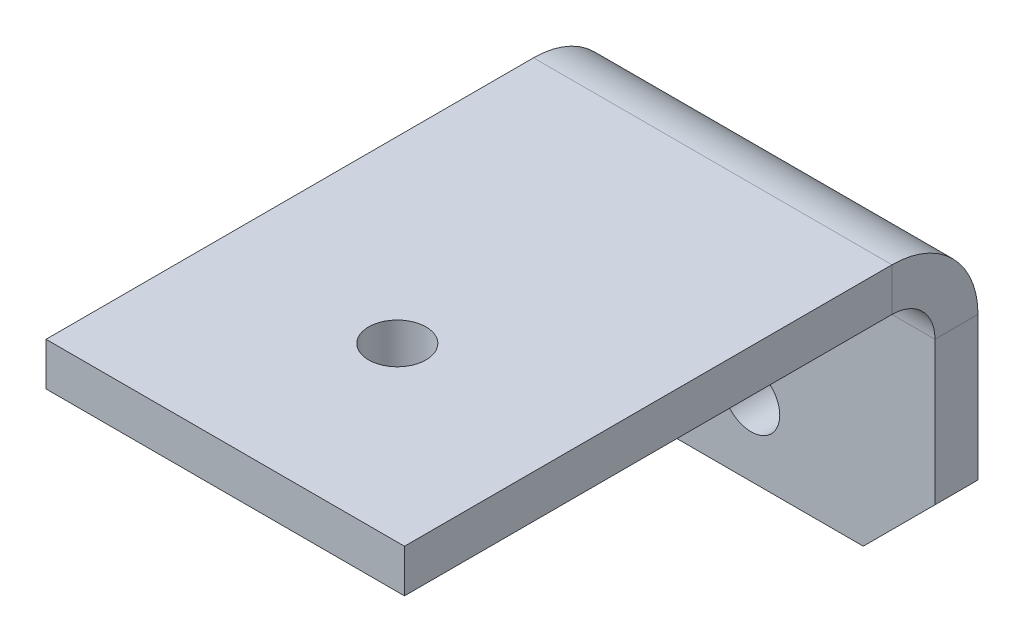
ISO-10303-21;
HEADER;
FILE_DESCRIPTION(('STEP AP214'),'2;1');
FILE_NAME('part.step','',(''),(''),'','','');
FILE_SCHEMA(('AUTOMOTIVE_DESIGN { 1 0 10303 214 1 1 1 1 }'));
ENDSEC;
DATA;
#1=APPLICATION_CONTEXT('core data for automotive mechanical design processes');
#2=APPLICATION_PROTOCOL_DEFINITION('international standard','automotive_design',2000,#1);
#3=PRODUCT_CONTEXT('',#1,'mechanical');
#4=PRODUCT('Part','Part','',(#3));
#5=PRODUCT_RELATED_PRODUCT_CATEGORY('part','',(#4));
#6=PRODUCT_DEFINITION_FORMATION('','',#4);
#7=PRODUCT_DEFINITION_CONTEXT('part definition',#1,'design');
#8=PRODUCT_DEFINITION('design','',#6,#7);
#9=PRODUCT_DEFINITION_SHAPE('','',#8);
#10=(LENGTH_UNIT() NAMED_UNIT(*) SI_UNIT(.MILLI.,.METRE.));
#11=(NAMED_UNIT(*) PLANE_ANGLE_UNIT() SI_UNIT($,.RADIAN.));
#12=(NAMED_UNIT(*) SI_UNIT($,.STERADIAN.) SOLID_ANGLE_UNIT());
#13=UNCERTAINTY_MEASURE_WITH_UNIT(LENGTH_MEASURE(1.E-05),#10,'distance_accuracy_value','');
#14=(GEOMETRIC_REPRESENTATION_CONTEXT(3) GLOBAL_UNCERTAINTY_ASSIGNED_CONTEXT((#13)) GLOBAL_UNIT_ASSIGNED_CONTEXT((#10,
#11,#12)) REPRESENTATION_CONTEXT('',''));
#15=CARTESIAN_POINT('',(0.,0.,0.));
#16=DIRECTION('',(0.,0.,1.));
#17=DIRECTION('',(1.,0.,0.));
#18=AXIS2_PLACEMENT_3D('',#15,#16,#17);
#19=CARTESIAN_POINT('',(-12.1740943166717,9.19624747560956,-3.));
#20=DIRECTION('',(-1.,0.,0.));
#21=DIRECTION('',(0.,-1.,0.));
#22=AXIS2_PLACEMENT_3D('',#19,#20,#21);
#23=PLANE('',#22);
#24=DIRECTION('',(0.,-1.,0.));
#25=VECTOR('',#24,1.);
#26=CARTESIAN_POINT('',(-12.1740943166717,9.19624747560956,-3.));
#27=LINE('',#26,#25);
#28=CARTESIAN_POINT('',(-12.1740943166717,9.19624747560956,-3.));
#29=VERTEX_POINT('',#28);
#30=CARTESIAN_POINT('',(-12.1740943166717,-0.803752524390404,-3.));
#31=VERTEX_POINT('',#30);
#32=EDGE_CURVE('E200',#29,#31,#27,.T.);
#33=ORIENTED_EDGE('',*,*,#32,.T.);
#34=DIRECTION('',(0.,0.,1.));
#35=VECTOR('',#34,1.);
#36=CARTESIAN_POINT('',(-12.1740943166717,-0.803752524390404,-3.));
#37=LINE('',#36,#35);
#38=CARTESIAN_POINT('',(-12.1740943166717,-0.803752524390404,0.));
#39=VERTEX_POINT('',#38);
#40=EDGE_CURVE('E224',#31,#39,#37,.T.);
#41=ORIENTED_EDGE('',*,*,#40,.T.);
#42=DIRECTION('',(0.,-1.,0.));
#43=VECTOR('',#42,1.);
#44=CARTESIAN_POINT('',(-12.1740943166717,9.19624747560956,0.));
#45=LINE('',#44,#43);
#46=CARTESIAN_POINT('',(-12.1740943166717,9.19624747560956,0.));
#47=VERTEX_POINT('',#46);
#48=EDGE_CURVE('E197',#47,#39,#45,.T.);
#49=ORIENTED_EDGE('',*,*,#48,.F.);
#50=DIRECTION('',(0.,0.,1.));
#51=VECTOR('',#50,1.);
#52=CARTESIAN_POINT('',(-12.1740943166717,9.19624747560956,-3.));
#53=LINE('',#52,#51);
#54=EDGE_CURVE('E221',#29,#47,#53,.T.);
#55=ORIENTED_EDGE('',*,*,#54,.F.);
#56=EDGE_LOOP('',(#33,#41,#49,#55));
#57=FACE_BOUND('',#56,.T.);
#58=ADVANCED_FACE('F58',(#57),#23,.T.);
#59=CARTESIAN_POINT('',(12.8259056833283,9.19624747560956,-3.));
#60=DIRECTION('',(1.,0.,0.));
#61=DIRECTION('',(0.,1.,0.));
#62=AXIS2_PLACEMENT_3D('',#59,#60,#61);
#63=PLANE('',#62);
#64=DIRECTION('',(0.,1.,0.));
#65=VECTOR('',#64,1.);
#66=CARTESIAN_POINT('',(12.8259056833283,9.19624747560956,0.));
#67=LINE('',#66,#65);
#68=CARTESIAN_POINT('',(12.8259056833283,-0.803752524390404,0.));
#69=VERTEX_POINT('',#68);
#70=CARTESIAN_POINT('',(12.8259056833283,9.19624747560956,0.));
#71=VERTEX_POINT('',#70);
#72=EDGE_CURVE('E217',#69,#71,#67,.T.);
#73=ORIENTED_EDGE('',*,*,#72,.F.);
#74=DIRECTION('',(0.,0.,-1.));
#75=VECTOR('',#74,1.);
#76=CARTESIAN_POINT('',(12.8259056833283,-0.803752524390404,-3.));
#77=LINE('',#76,#75);
#78=CARTESIAN_POINT('',(12.8259056833283,-0.803752524390404,-3.));
#79=VERTEX_POINT('',#78);
#80=EDGE_CURVE('E67',#69,#79,#77,.T.);
#81=ORIENTED_EDGE('',*,*,#80,.T.);
#82=DIRECTION('',(0.,1.,0.));
#83=VECTOR('',#82,1.);
#84=CARTESIAN_POINT('',(12.8259056833283,9.19624747560956,-3.));
#85=LINE('',#84,#83);
#86=CARTESIAN_POINT('',(12.8259056833283,9.19624747560956,-3.));
#87=VERTEX_POINT('',#86);
#88=EDGE_CURVE('E207',#79,#87,#85,.T.);
#89=ORIENTED_EDGE('',*,*,#88,.T.);
#90=DIRECTION('',(0.,0.,1.));
#91=VECTOR('',#90,1.);
#92=CARTESIAN_POINT('',(12.8259056833283,9.19624747560956,-3.));
#93=LINE('',#92,#91);
#94=EDGE_CURVE('E212',#87,#71,#93,.T.);
#95=ORIENTED_EDGE('',*,*,#94,.T.);
#96=EDGE_LOOP('',(#73,#81,#89,#95));
#97=FACE_BOUND('',#96,.T.);
#98=ADVANCED_FACE('F263',(#97),#63,.T.);
#99=CARTESIAN_POINT('',(-12.1740943166717,-5.80375252439044,-3.));
#100=DIRECTION('',(0.,-1.,0.));
#101=DIRECTION('',(0.,0.,-1.));
#102=AXIS2_PLACEMENT_3D('',#99,#100,#101);
#103=PLANE('',#102);
#104=DIRECTION('',(1.,0.,0.));
#105=VECTOR('',#104,1.);
#106=CARTESIAN_POINT('',(-12.1740943166717,-5.80375252439044,-3.));
#107=LINE('',#106,#105);
#108=CARTESIAN_POINT('',(-7.17409431667171,-5.80375252439044,-3.));
#109=VERTEX_POINT('',#108);
#110=CARTESIAN_POINT('',(7.82590568332822,-5.80375252439044,-3.));
#111=VERTEX_POINT('',#110);
#112=EDGE_CURVE('E203',#109,#111,#107,.T.);
#113=ORIENTED_EDGE('',*,*,#112,.T.);
#114=DIRECTION('',(0.,0.,1.));
#115=VECTOR('',#114,1.);
#116=CARTESIAN_POINT('',(7.82590568332822,-5.80375252439044,-3.));
#117=LINE('',#116,#115);
#118=CARTESIAN_POINT('',(7.82590568332822,-5.80375252439044,0.));
#119=VERTEX_POINT('',#118);
#120=EDGE_CURVE('E235',#111,#119,#117,.T.);
#121=ORIENTED_EDGE('',*,*,#120,.T.);
#122=DIRECTION('',(1.,0.,0.));
#123=VECTOR('',#122,1.);
#124=CARTESIAN_POINT('',(-12.1740943166717,-5.80375252439044,0.));
#125=LINE('',#124,#123);
#126=CARTESIAN_POINT('',(-7.17409431667171,-5.80375252439044,0.));
#127=VERTEX_POINT('',#126);
#128=EDGE_CURVE('E215',#127,#119,#125,.T.);
#129=ORIENTED_EDGE('',*,*,#128,.F.);
#130=DIRECTION('',(0.,0.,-1.));
#131=VECTOR('',#130,1.);
#132=CARTESIAN_POINT('',(-7.17409431667171,-5.80375252439044,-3.));
#133=LINE('',#132,#131);
#134=EDGE_CURVE('E231',#127,#109,#133,.T.);
#135=ORIENTED_EDGE('',*,*,#134,.T.);
#136=EDGE_LOOP('',(#113,#121,#129,#135));
#137=FACE_BOUND('',#136,.T.);
#138=ADVANCED_FACE('F241',(#137),#103,.T.);
#139=CARTESIAN_POINT('',(0.,0.,-3.));
#140=DIRECTION('',(0.,0.,1.));
#141=DIRECTION('',(1.,0.,0.));
#142=AXIS2_PLACEMENT_3D('',#139,#140,#141);
#143=PLANE('',#142);
#144=CARTESIAN_POINT('',(0.,-0.80375252439044,-3.));
#145=DIRECTION('',(0.,0.,1.));
#146=DIRECTION('',(1.,0.,0.));
#147=AXIS2_PLACEMENT_3D('',#144,#145,#146);
#148=CIRCLE('',#147,2.);
#149=CARTESIAN_POINT('',(2.,-0.80375252439044,-3.));
#150=VERTEX_POINT('',#149);
#151=EDGE_CURVE('E194',#150,#150,#148,.T.);
#152=ORIENTED_EDGE('',*,*,#151,.T.);
#153=EDGE_LOOP('',(#152));
#154=FACE_BOUND('',#153,.T.);
#155=ORIENTED_EDGE('',*,*,#88,.F.);
#156=DIRECTION('',(0.707106781186547,0.707106781186548,0.));
#157=VECTOR('',#156,1.);
#158=CARTESIAN_POINT('',(7.82590568332822,-5.80375252439044,-3.));
#159=LINE('',#158,#157);
#160=EDGE_CURVE('E13',#79,#111,#159,.F.);
#161=ORIENTED_EDGE('',*,*,#160,.T.);
#162=ORIENTED_EDGE('',*,*,#112,.F.);
#163=DIRECTION('',(0.707106781186548,-0.707106781186547,0.));
#164=VECTOR('',#163,1.);
#165=CARTESIAN_POINT('',(-12.1740943166717,-0.803752524390404,-3.));
#166=LINE('',#165,#164);
#167=EDGE_CURVE('E233',#109,#31,#166,.F.);
#168=ORIENTED_EDGE('',*,*,#167,.T.);
#169=ORIENTED_EDGE('',*,*,#32,.F.);
#170=DIRECTION('',(-1.,0.,0.));
#171=VECTOR('',#170,1.);
#172=CARTESIAN_POINT('',(-12.1740943166717,9.19624747560956,-3.));
#173=LINE('',#172,#171);
#174=EDGE_CURVE('E209',#87,#29,#173,.T.);
#175=ORIENTED_EDGE('',*,*,#174,.F.);
#176=EDGE_LOOP('',(#155,#161,#162,#168,#169,#175));
#177=FACE_BOUND('',#176,.T.);
#178=ADVANCED_FACE('F255',(#154,#177),#143,.F.);
#179=CARTESIAN_POINT('',(0.,0.,0.));
#180=DIRECTION('',(0.,0.,1.));
#181=DIRECTION('',(1.,0.,0.));
#182=AXIS2_PLACEMENT_3D('',#179,#180,#181);
#183=PLANE('',#182);
#184=CARTESIAN_POINT('',(0.,-0.80375252439044,0.));
#185=DIRECTION('',(0.,0.,1.));
#186=DIRECTION('',(1.,0.,0.));
#187=AXIS2_PLACEMENT_3D('',#184,#185,#186);
#188=CIRCLE('',#187,2.);
#189=CARTESIAN_POINT('',(2.,-0.80375252439044,0.));
#190=VERTEX_POINT('',#189);
#191=EDGE_CURVE('E184',#190,#190,#188,.T.);
#192=ORIENTED_EDGE('',*,*,#191,.F.);
#193=EDGE_LOOP('',(#192));
#194=FACE_BOUND('',#193,.T.);
#195=ORIENTED_EDGE('',*,*,#128,.T.);
#196=DIRECTION('',(-0.707106781186547,-0.707106781186548,0.));
#197=VECTOR('',#196,1.);
#198=CARTESIAN_POINT('',(6.81482910385933,-6.81482910385933,0.));
#199=LINE('',#198,#197);
#200=EDGE_CURVE('E81',#119,#69,#199,.F.);
#201=ORIENTED_EDGE('',*,*,#200,.T.);
#202=ORIENTED_EDGE('',*,*,#72,.T.);
#203=DIRECTION('',(-1.,0.,0.));
#204=VECTOR('',#203,1.);
#205=CARTESIAN_POINT('',(-12.1740943166717,9.19624747560956,0.));
#206=LINE('',#205,#204);
#207=EDGE_CURVE('E204',#71,#47,#206,.T.);
#208=ORIENTED_EDGE('',*,*,#207,.T.);
#209=ORIENTED_EDGE('',*,*,#48,.T.);
#210=DIRECTION('',(-0.707106781186548,0.707106781186547,0.));
#211=VECTOR('',#210,1.);
#212=CARTESIAN_POINT('',(-6.48892342053107,-6.48892342053108,0.));
#213=LINE('',#212,#211);
#214=EDGE_CURVE('E229',#39,#127,#213,.F.);
#215=ORIENTED_EDGE('',*,*,#214,.T.);
#216=EDGE_LOOP('',(#195,#201,#202,#208,#209,#215));
#217=FACE_BOUND('',#216,.T.);
#218=ADVANCED_FACE('F246',(#194,#217),#183,.T.);
#219=CARTESIAN_POINT('',(0.,-0.80375252439044,-3.));
#220=DIRECTION('',(0.,0.,1.));
#221=DIRECTION('',(1.,0.,0.));
#222=AXIS2_PLACEMENT_3D('',#219,#220,#221);
#223=CYLINDRICAL_SURFACE('',#222,2.);
#224=ORIENTED_EDGE('',*,*,#151,.F.);
#225=EDGE_LOOP('',(#224));
#226=FACE_BOUND('',#225,.T.);
#227=ORIENTED_EDGE('',*,*,#191,.T.);
#228=EDGE_LOOP('',(#227));
#229=FACE_BOUND('',#228,.T.);
#230=ADVANCED_FACE('F279',(#226,#229),#223,.F.);
#231=CARTESIAN_POINT('',(12.8259056833283,9.19624747560956,3.));
#232=DIRECTION('',(1.,0.,0.));
#233=DIRECTION('',(0.,0.,-1.));
#234=AXIS2_PLACEMENT_3D('',#231,#232,#233);
#235=PLANE('',#234);
#236=DIRECTION('',(0.,-1.,0.));
#237=VECTOR('',#236,1.);
#238=CARTESIAN_POINT('',(12.8259056833283,15.1962474756096,2.99999999999998));
#239=LINE('',#238,#237);
#240=CARTESIAN_POINT('',(12.8259056833283,12.1962474756096,2.99999999999999));
#241=VERTEX_POINT('',#240);
#242=CARTESIAN_POINT('',(12.8259056833283,15.1962474756096,2.99999999999998));
#243=VERTEX_POINT('',#242);
#244=EDGE_CURVE('E158',#241,#243,#239,.F.);
#245=ORIENTED_EDGE('',*,*,#244,.F.);
#246=CARTESIAN_POINT('',(12.8259056833283,9.19624747560956,3.));
#247=DIRECTION('',(-1.,0.,0.));
#248=DIRECTION('',(0.,0.,1.));
#249=AXIS2_PLACEMENT_3D('',#246,#247,#248);
#250=CIRCLE('',#249,3.);
#251=EDGE_CURVE('E188',#71,#241,#250,.F.);
#252=ORIENTED_EDGE('',*,*,#251,.F.);
#253=ORIENTED_EDGE('',*,*,#94,.F.);
#254=CARTESIAN_POINT('',(12.8259056833283,9.19624747560956,3.));
#255=DIRECTION('',(-1.,0.,0.));
#256=DIRECTION('',(0.,0.,1.));
#257=AXIS2_PLACEMENT_3D('',#254,#255,#256);
#258=CIRCLE('',#257,6.);
#259=EDGE_CURVE('E181',#87,#243,#258,.F.);
#260=ORIENTED_EDGE('',*,*,#259,.T.);
#261=EDGE_LOOP('',(#245,#252,#253,#260));
#262=FACE_BOUND('',#261,.T.);
#263=ADVANCED_FACE('F286',(#262),#235,.T.);
#264=CARTESIAN_POINT('',(-12.1740943166717,9.19624747560956,3.));
#265=DIRECTION('',(1.,0.,0.));
#266=DIRECTION('',(0.,0.,-1.));
#267=AXIS2_PLACEMENT_3D('',#264,#265,#266);
#268=PLANE('',#267);
#269=CARTESIAN_POINT('',(-12.1740943166717,9.19624747560956,3.));
#270=DIRECTION('',(-1.,0.,0.));
#271=DIRECTION('',(0.,0.,1.));
#272=AXIS2_PLACEMENT_3D('',#269,#270,#271);
#273=CIRCLE('',#272,3.);
#274=CARTESIAN_POINT('',(-12.1740943166717,12.1962474756096,2.99999999999999));
#275=VERTEX_POINT('',#274);
#276=EDGE_CURVE('E191',#275,#47,#273,.T.);
#277=ORIENTED_EDGE('',*,*,#276,.F.);
#278=DIRECTION('',(0.,-1.,0.));
#279=VECTOR('',#278,1.);
#280=CARTESIAN_POINT('',(-12.1740943166718,12.1962474756096,2.99999999999999));
#281=LINE('',#280,#279);
#282=CARTESIAN_POINT('',(-12.1740943166717,15.1962474756096,2.99999999999998));
#283=VERTEX_POINT('',#282);
#284=EDGE_CURVE('E175',#275,#283,#281,.F.);
#285=ORIENTED_EDGE('',*,*,#284,.T.);
#286=CARTESIAN_POINT('',(-12.1740943166717,9.19624747560956,3.));
#287=DIRECTION('',(-1.,0.,0.));
#288=DIRECTION('',(0.,0.,1.));
#289=AXIS2_PLACEMENT_3D('',#286,#287,#288);
#290=CIRCLE('',#289,6.);
#291=EDGE_CURVE('E185',#283,#29,#290,.T.);
#292=ORIENTED_EDGE('',*,*,#291,.T.);
#293=ORIENTED_EDGE('',*,*,#54,.T.);
#294=EDGE_LOOP('',(#277,#285,#292,#293));
#295=FACE_BOUND('',#294,.T.);
#296=ADVANCED_FACE('F288',(#295),#268,.F.);
#297=CARTESIAN_POINT('',(-12.1740943166718,9.19624747560956,3.));
#298=DIRECTION('',(-1.,0.,0.));
#299=DIRECTION('',(0.,1.,0.));
#300=AXIS2_PLACEMENT_3D('',#297,#298,#299);
#301=CYLINDRICAL_SURFACE('',#300,6.);
#302=ORIENTED_EDGE('',*,*,#174,.T.);
#303=ORIENTED_EDGE('',*,*,#291,.F.);
#304=DIRECTION('',(-1.,0.,0.));
#305=VECTOR('',#304,1.);
#306=CARTESIAN_POINT('',(12.8259056833283,15.1962474756096,2.99999999999998));
#307=LINE('',#306,#305);
#308=EDGE_CURVE('E173',#283,#243,#307,.F.);
#309=ORIENTED_EDGE('',*,*,#308,.T.);
#310=ORIENTED_EDGE('',*,*,#259,.F.);
#311=EDGE_LOOP('',(#302,#303,#309,#310));
#312=FACE_BOUND('',#311,.T.);
#313=ADVANCED_FACE('F291',(#312),#301,.T.);
#314=CARTESIAN_POINT('',(-12.1740943166718,9.19624747560956,3.));
#315=DIRECTION('',(-1.,0.,0.));
#316=DIRECTION('',(0.,1.,0.));
#317=AXIS2_PLACEMENT_3D('',#314,#315,#316);
#318=CYLINDRICAL_SURFACE('',#317,3.);
#319=ORIENTED_EDGE('',*,*,#207,.F.);
#320=ORIENTED_EDGE('',*,*,#251,.T.);
#321=DIRECTION('',(-1.,0.,0.));
#322=VECTOR('',#321,1.);
#323=CARTESIAN_POINT('',(12.8259056833283,12.1962474756096,2.99999999999999));
#324=LINE('',#323,#322);
#325=EDGE_CURVE('E178',#241,#275,#324,.T.);
#326=ORIENTED_EDGE('',*,*,#325,.T.);
#327=ORIENTED_EDGE('',*,*,#276,.T.);
#328=EDGE_LOOP('',(#319,#320,#326,#327));
#329=FACE_BOUND('',#328,.T.);
#330=ADVANCED_FACE('F296',(#329),#318,.F.);
#331=CARTESIAN_POINT('',(0.,15.1962474756095,0.));
#332=DIRECTION('',(0.,-1.,0.));
#333=DIRECTION('',(0.,0.,-1.));
#334=AXIS2_PLACEMENT_3D('',#331,#332,#333);
#335=PLANE('',#334);
#336=CARTESIAN_POINT('',(0.325905683328256,15.1962474756096,25.));
#337=DIRECTION('',(0.,-1.,0.));
#338=DIRECTION('',(0.,0.,-1.));
#339=AXIS2_PLACEMENT_3D('',#336,#337,#338);
#340=CIRCLE('',#339,2.);
#341=CARTESIAN_POINT('',(0.325905683328256,15.1962474756096,23.));
#342=VERTEX_POINT('',#341);
#343=EDGE_CURVE('E167',#342,#342,#340,.F.);
#344=ORIENTED_EDGE('',*,*,#343,.F.);
#345=EDGE_LOOP('',(#344));
#346=FACE_BOUND('',#345,.T.);
#347=ORIENTED_EDGE('',*,*,#308,.F.);
#348=DIRECTION('',(0.,0.,1.));
#349=VECTOR('',#348,1.);
#350=CARTESIAN_POINT('',(-12.1740943166717,15.1962474756095,0.));
#351=LINE('',#350,#349);
#352=CARTESIAN_POINT('',(-12.1740943166717,15.1962474756097,37.));
#353=VERTEX_POINT('',#352);
#354=EDGE_CURVE('E141',#283,#353,#351,.T.);
#355=ORIENTED_EDGE('',*,*,#354,.T.);
#356=DIRECTION('',(1.,0.,0.));
#357=VECTOR('',#356,1.);
#358=CARTESIAN_POINT('',(0.,15.1962474756097,37.));
#359=LINE('',#358,#357);
#360=CARTESIAN_POINT('',(12.8259056833283,15.1962474756097,37.));
#361=VERTEX_POINT('',#360);
#362=EDGE_CURVE('E134',#353,#361,#359,.T.);
#363=ORIENTED_EDGE('',*,*,#362,.T.);
#364=DIRECTION('',(0.,0.,-1.));
#365=VECTOR('',#364,1.);
#366=CARTESIAN_POINT('',(12.8259056833283,15.1962474756095,0.));
#367=LINE('',#366,#365);
#368=EDGE_CURVE('E139',#361,#243,#367,.T.);
#369=ORIENTED_EDGE('',*,*,#368,.T.);
#370=EDGE_LOOP('',(#347,#355,#363,#369));
#371=FACE_BOUND('',#370,.T.);
#372=ADVANCED_FACE('F137',(#346,#371),#335,.F.);
#373=CARTESIAN_POINT('',(0.,12.1962474756095,0.));
#374=DIRECTION('',(0.,-1.,0.));
#375=DIRECTION('',(0.,0.,-1.));
#376=AXIS2_PLACEMENT_3D('',#373,#374,#375);
#377=PLANE('',#376);
#378=CARTESIAN_POINT('',(0.325905683328256,12.1962474756096,25.));
#379=DIRECTION('',(0.,-1.,0.));
#380=DIRECTION('',(0.,0.,-1.));
#381=AXIS2_PLACEMENT_3D('',#378,#379,#380);
#382=CIRCLE('',#381,2.);
#383=CARTESIAN_POINT('',(0.325905683328256,12.1962474756096,23.));
#384=VERTEX_POINT('',#383);
#385=EDGE_CURVE('E170',#384,#384,#382,.F.);
#386=ORIENTED_EDGE('',*,*,#385,.T.);
#387=EDGE_LOOP('',(#386));
#388=FACE_BOUND('',#387,.T.);
#389=DIRECTION('',(0.,0.,-1.));
#390=VECTOR('',#389,1.);
#391=CARTESIAN_POINT('',(-12.1740943166717,12.1962474756097,37.));
#392=LINE('',#391,#390);
#393=CARTESIAN_POINT('',(-12.1740943166717,12.1962474756097,37.));
#394=VERTEX_POINT('',#393);
#395=EDGE_CURVE('E161',#275,#394,#392,.F.);
#396=ORIENTED_EDGE('',*,*,#395,.F.);
#397=ORIENTED_EDGE('',*,*,#325,.F.);
#398=DIRECTION('',(0.,0.,1.));
#399=VECTOR('',#398,1.);
#400=CARTESIAN_POINT('',(12.8259056833283,12.1962474756095,0.));
#401=LINE('',#400,#399);
#402=CARTESIAN_POINT('',(12.8259056833283,12.1962474756097,37.));
#403=VERTEX_POINT('',#402);
#404=EDGE_CURVE('E165',#403,#241,#401,.F.);
#405=ORIENTED_EDGE('',*,*,#404,.F.);
#406=DIRECTION('',(-1.,0.,0.));
#407=VECTOR('',#406,1.);
#408=CARTESIAN_POINT('',(12.8259056833283,12.1962474756097,37.));
#409=LINE('',#408,#407);
#410=EDGE_CURVE('E150',#394,#403,#409,.F.);
#411=ORIENTED_EDGE('',*,*,#410,.F.);
#412=EDGE_LOOP('',(#396,#397,#405,#411));
#413=FACE_BOUND('',#412,.T.);
#414=ADVANCED_FACE('F306',(#388,#413),#377,.T.);
#415=CARTESIAN_POINT('',(12.8259056833283,15.1962474756095,0.));
#416=DIRECTION('',(-1.,0.,0.));
#417=DIRECTION('',(0.,0.,1.));
#418=AXIS2_PLACEMENT_3D('',#415,#416,#417);
#419=PLANE('',#418);
#420=ORIENTED_EDGE('',*,*,#244,.T.);
#421=ORIENTED_EDGE('',*,*,#368,.F.);
#422=DIRECTION('',(0.,-1.,0.));
#423=VECTOR('',#422,1.);
#424=CARTESIAN_POINT('',(12.8259056833283,15.1962474756097,37.));
#425=LINE('',#424,#423);
#426=EDGE_CURVE('E145',#361,#403,#425,.T.);
#427=ORIENTED_EDGE('',*,*,#426,.T.);
#428=ORIENTED_EDGE('',*,*,#404,.T.);
#429=EDGE_LOOP('',(#420,#421,#427,#428));
#430=FACE_BOUND('',#429,.T.);
#431=ADVANCED_FACE('F157',(#430),#419,.F.);
#432=CARTESIAN_POINT('',(-12.1740943166717,15.1962474756097,37.));
#433=DIRECTION('',(1.,0.,0.));
#434=DIRECTION('',(0.,0.,-1.));
#435=AXIS2_PLACEMENT_3D('',#432,#433,#434);
#436=PLANE('',#435);
#437=ORIENTED_EDGE('',*,*,#284,.F.);
#438=ORIENTED_EDGE('',*,*,#395,.T.);
#439=DIRECTION('',(0.,-1.,0.));
#440=VECTOR('',#439,1.);
#441=CARTESIAN_POINT('',(-12.1740943166718,15.1962474756097,37.));
#442=LINE('',#441,#440);
#443=EDGE_CURVE('E154',#353,#394,#442,.T.);
#444=ORIENTED_EDGE('',*,*,#443,.F.);
#445=ORIENTED_EDGE('',*,*,#354,.F.);
#446=EDGE_LOOP('',(#437,#438,#444,#445));
#447=FACE_BOUND('',#446,.T.);
#448=ADVANCED_FACE('F305',(#447),#436,.F.);
#449=CARTESIAN_POINT('',(12.8259056833283,15.1962474756097,37.));
#450=DIRECTION('',(0.,0.,-1.));
#451=DIRECTION('',(0.,1.,0.));
#452=AXIS2_PLACEMENT_3D('',#449,#450,#451);
#453=PLANE('',#452);
#454=ORIENTED_EDGE('',*,*,#410,.T.);
#455=ORIENTED_EDGE('',*,*,#426,.F.);
#456=ORIENTED_EDGE('',*,*,#362,.F.);
#457=ORIENTED_EDGE('',*,*,#443,.T.);
#458=EDGE_LOOP('',(#454,#455,#456,#457));
#459=FACE_BOUND('',#458,.T.);
#460=ADVANCED_FACE('F148',(#459),#453,.F.);
#461=CARTESIAN_POINT('',(0.325905683328256,15.1962474756096,25.));
#462=DIRECTION('',(0.,-1.,0.));
#463=DIRECTION('',(0.,0.,-1.));
#464=AXIS2_PLACEMENT_3D('',#461,#462,#463);
#465=CYLINDRICAL_SURFACE('',#464,2.);
#466=ORIENTED_EDGE('',*,*,#343,.T.);
#467=EDGE_LOOP('',(#466));
#468=FACE_BOUND('',#467,.T.);
#469=ORIENTED_EDGE('',*,*,#385,.F.);
#470=EDGE_LOOP('',(#469));
#471=FACE_BOUND('',#470,.T.);
#472=ADVANCED_FACE('F261',(#468,#471),#465,.F.);
#473=CARTESIAN_POINT('',(-12.1740943166717,-0.803752524390404,-3.));
#474=DIRECTION('',(0.707106781186547,0.707106781186548,0.));
#475=DIRECTION('',(0.,0.,1.));
#476=AXIS2_PLACEMENT_3D('',#473,#474,#475);
#477=PLANE('',#476);
#478=ORIENTED_EDGE('',*,*,#167,.F.);
#479=ORIENTED_EDGE('',*,*,#134,.F.);
#480=ORIENTED_EDGE('',*,*,#214,.F.);
#481=ORIENTED_EDGE('',*,*,#40,.F.);
#482=EDGE_LOOP('',(#478,#479,#480,#481));
#483=FACE_BOUND('',#482,.T.);
#484=ADVANCED_FACE('F250',(#483),#477,.F.);
#485=CARTESIAN_POINT('',(7.82590568332822,-5.80375252439044,-3.));
#486=DIRECTION('',(-0.707106781186548,0.707106781186547,0.));
#487=DIRECTION('',(0.,0.,1.));
#488=AXIS2_PLACEMENT_3D('',#485,#486,#487);
#489=PLANE('',#488);
#490=ORIENTED_EDGE('',*,*,#160,.F.);
#491=ORIENTED_EDGE('',*,*,#80,.F.);
#492=ORIENTED_EDGE('',*,*,#200,.F.);
#493=ORIENTED_EDGE('',*,*,#120,.F.);
#494=EDGE_LOOP('',(#490,#491,#492,#493));
#495=FACE_BOUND('',#494,.T.);
#496=ADVANCED_FACE('F61',(#495),#489,.F.);
#497=CLOSED_SHELL('',(#58,#98,#138,#178,#218,#230,#263,#296,#313,#330,#372,#414,#431,#448,#460,
#472,#484,#496));
#498=MANIFOLD_SOLID_BREP('B2',#497);
#499=ADVANCED_BREP_SHAPE_REPRESENTATION('',(#18,#498),#14);
#500=SHAPE_DEFINITION_REPRESENTATION(#9,#499);
ENDSEC;
END-ISO-10303-21;
